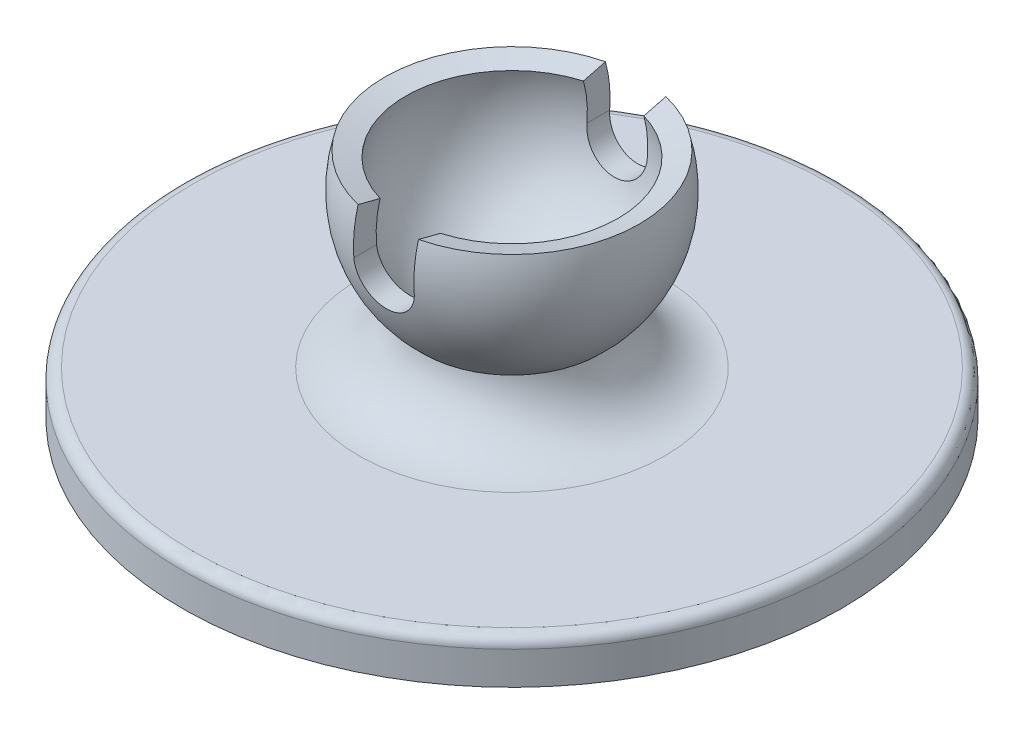
ISO-10303-21;
HEADER;
FILE_DESCRIPTION(('STEP AP214'),'2;1');
FILE_NAME('part.step','',(''),(''),'','','');
FILE_SCHEMA(('AUTOMOTIVE_DESIGN { 1 0 10303 214 1 1 1 1 }'));
ENDSEC;
DATA;
#1=APPLICATION_CONTEXT('core data for automotive mechanical design processes');
#2=APPLICATION_PROTOCOL_DEFINITION('international standard','automotive_design',2000,#1);
#3=PRODUCT_CONTEXT('',#1,'mechanical');
#4=PRODUCT('Part','Part','',(#3));
#5=PRODUCT_RELATED_PRODUCT_CATEGORY('part','',(#4));
#6=PRODUCT_DEFINITION_FORMATION('','',#4);
#7=PRODUCT_DEFINITION_CONTEXT('part definition',#1,'design');
#8=PRODUCT_DEFINITION('design','',#6,#7);
#9=PRODUCT_DEFINITION_SHAPE('','',#8);
#10=(LENGTH_UNIT() NAMED_UNIT(*) SI_UNIT(.MILLI.,.METRE.));
#11=(NAMED_UNIT(*) PLANE_ANGLE_UNIT() SI_UNIT($,.RADIAN.));
#12=(NAMED_UNIT(*) SI_UNIT($,.STERADIAN.) SOLID_ANGLE_UNIT());
#13=UNCERTAINTY_MEASURE_WITH_UNIT(LENGTH_MEASURE(1.E-05),#10,'distance_accuracy_value','');
#14=(GEOMETRIC_REPRESENTATION_CONTEXT(3) GLOBAL_UNCERTAINTY_ASSIGNED_CONTEXT((#13)) GLOBAL_UNIT_ASSIGNED_CONTEXT((#10,
#11,#12)) REPRESENTATION_CONTEXT('',''));
#15=CARTESIAN_POINT('',(0.,0.,0.));
#16=DIRECTION('',(0.,0.,1.));
#17=DIRECTION('',(1.,0.,0.));
#18=AXIS2_PLACEMENT_3D('',#15,#16,#17);
#19=CARTESIAN_POINT('',(0.,8.55291427061511,0.));
#20=DIRECTION('',(0.,1.,0.));
#21=DIRECTION('',(-1.,0.,0.));
#22=AXIS2_PLACEMENT_3D('',#19,#20,#21);
#23=CONICAL_SURFACE('',#22,5.79555495773441,1.30899693899575);
#24=CARTESIAN_POINT('',(0.,8.55291427061511,0.));
#25=DIRECTION('',(0.,1.,0.));
#26=DIRECTION('',(-1.,0.,0.));
#27=AXIS2_PLACEMENT_3D('',#24,#25,#26);
#28=CIRCLE('',#27,5.79555495773441);
#29=CARTESIAN_POINT('',(-1.375,8.55291427061511,-5.63008279407327));
#30=VERTEX_POINT('',#29);
#31=CARTESIAN_POINT('',(-1.375,8.55291427061511,5.63008279407327));
#32=VERTEX_POINT('',#31);
#33=EDGE_CURVE('E132',#30,#32,#28,.T.);
#34=ORIENTED_EDGE('',*,*,#33,.T.);
#35=CARTESIAN_POINT('',(-1.375,10.4367350616613,12.7521544498145));
#36=CARTESIAN_POINT('',(-1.375,10.2939405256424,12.2161041387018));
#37=CARTESIAN_POINT('',(-1.375,10.1512212962795,11.6800337180274));
#38=CARTESIAN_POINT('',(-1.375,9.86580186331822,10.606780273529));
#39=CARTESIAN_POINT('',(-1.375,9.72310222774603,10.0695970986722));
#40=CARTESIAN_POINT('',(-1.375,9.43218092227778,8.9726348821279));
#41=CARTESIAN_POINT('',(-1.375,9.28397803003374,8.41285085504461));
#42=CARTESIAN_POINT('',(-1.375,9.06246145117722,7.57355282622851));
#43=CARTESIAN_POINT('',(-1.375,8.98882575742838,7.2941238333845));
#44=CARTESIAN_POINT('',(-1.375,8.84185753215335,6.73519643013197));
#45=CARTESIAN_POINT('',(-1.375,8.76852499021496,6.45569802246306));
#46=CARTESIAN_POINT('',(-1.375,8.62676192318278,5.91367818110676));
#47=CARTESIAN_POINT('',(-1.375,8.55830578503265,5.65116344925173));
#48=CARTESIAN_POINT('',(-1.375,8.42194435428133,5.12595497051009));
#49=CARTESIAN_POINT('',(-1.375,8.35403913301479,4.86326120506873));
#50=CARTESIAN_POINT('',(-1.375,8.21869272015601,4.33606321081525));
#51=CARTESIAN_POINT('',(-1.375,8.15125680515652,4.07155762664674));
#52=CARTESIAN_POINT('',(-1.375,8.01786415899113,3.54230410428294));
#53=CARTESIAN_POINT('',(-1.375,7.95190674295933,3.27755634000286));
#54=CARTESIAN_POINT('',(-1.375,7.85591170884192,2.88370413083946));
#55=CARTESIAN_POINT('',(-1.375,7.82484334352691,2.75485147964918));
#56=CARTESIAN_POINT('',(-1.375,7.76361653212868,2.49693001993708));
#57=CARTESIAN_POINT('',(-1.375,7.73345808184057,2.36786121241707));
#58=CARTESIAN_POINT('',(-1.375,7.67439175519903,2.10916594741611));
#59=CARTESIAN_POINT('',(-1.375,7.64548648473158,1.97953889140758));
#60=CARTESIAN_POINT('',(-1.375,7.58964236993162,1.7198633501757));
#61=CARTESIAN_POINT('',(-1.375,7.56270344515201,1.58981488242074));
#62=CARTESIAN_POINT('',(-1.375,7.51218219548286,1.33077691992004));
#63=CARTESIAN_POINT('',(-1.375,7.48856146207588,1.20179505677248));
#64=CARTESIAN_POINT('',(-1.375,7.44591832613553,0.943044784825864));
#65=CARTESIAN_POINT('',(-1.375,7.42689619246422,0.813276330492376));
#66=CARTESIAN_POINT('',(-1.375,7.39594424063566,0.55340568454436));
#67=CARTESIAN_POINT('',(-1.375,7.3839840236685,0.423307380654786));
#68=CARTESIAN_POINT('',(-1.375,7.37305852636488,0.227800356470101));
#69=CARTESIAN_POINT('',(-1.375,7.37058563557824,0.16258386615113));
#70=CARTESIAN_POINT('',(-1.375,7.36811888586144,0.0321025616662649));
#71=CARTESIAN_POINT('',(-1.375,7.36812499520035,-0.0331622518704042));
#72=CARTESIAN_POINT('',(-1.375,7.37060127685139,-0.162672353823233));
#73=CARTESIAN_POINT('',(-1.375,7.37303478429299,-0.22691836285488));
#74=CARTESIAN_POINT('',(-1.375,7.38015812224114,-0.355287346135869));
#75=CARTESIAN_POINT('',(-1.375,7.38484813781129,-0.419410309860729));
#76=CARTESIAN_POINT('',(-1.375,7.40192684781888,-0.611568958392389));
#77=CARTESIAN_POINT('',(-1.375,7.41732270942996,-0.739337245584281));
#78=CARTESIAN_POINT('',(-1.375,7.45378224315079,-0.994604379941283));
#79=CARTESIAN_POINT('',(-1.375,7.47487119994015,-1.12209940384625));
#80=CARTESIAN_POINT('',(-1.375,7.52069515879427,-1.37639448649705));
#81=CARTESIAN_POINT('',(-1.375,7.54542944333312,-1.50319467692719));
#82=CARTESIAN_POINT('',(-1.375,7.59761230337411,-1.75798873494448));
#83=CARTESIAN_POINT('',(-1.375,7.62509265023422,-1.88597599935786));
#84=CARTESIAN_POINT('',(-1.375,7.68166022775117,-2.14159681702443));
#85=CARTESIAN_POINT('',(-1.375,7.71074751182396,-2.26923035837129));
#86=CARTESIAN_POINT('',(-1.375,7.76995699612921,-2.52398238491578));
#87=CARTESIAN_POINT('',(-1.375,7.80007697151843,-2.65110138969959));
#88=CARTESIAN_POINT('',(-1.375,7.86108870284829,-2.90515440309123));
#89=CARTESIAN_POINT('',(-1.375,7.89198046392286,-3.03208841046252));
#90=CARTESIAN_POINT('',(-1.375,7.98729880417245,-3.42009076142074));
#91=CARTESIAN_POINT('',(-1.375,8.05261481154021,-3.68094021118909));
#92=CARTESIAN_POINT('',(-1.375,8.18453159742587,-4.20231460957527));
#93=CARTESIAN_POINT('',(-1.375,8.25113238817949,-4.46283955507749));
#94=CARTESIAN_POINT('',(-1.375,8.38475659536228,-4.98223391526075));
#95=CARTESIAN_POINT('',(-1.375,8.45177559096703,-5.24110446793509));
#96=CARTESIAN_POINT('',(-1.375,8.58632936357547,-5.75871161943135));
#97=CARTESIAN_POINT('',(-1.375,8.65386414120847,-6.01744821808942));
#98=CARTESIAN_POINT('',(-1.375,8.86556783992799,-6.82630364651311));
#99=CARTESIAN_POINT('',(-1.375,9.01034663893564,-7.37626276391492));
#100=CARTESIAN_POINT('',(-1.375,9.30096296331856,-8.47701611075896));
#101=CARTESIAN_POINT('',(-1.375,9.44680197550137,-9.02780994677909));
#102=CARTESIAN_POINT('',(-1.375,9.73331396681568,-10.1080556987962));
#103=CARTESIAN_POINT('',(-1.375,9.87396949005197,-10.6375122449983));
#104=CARTESIAN_POINT('',(-1.375,10.1553049713321,-11.6953702764765));
#105=CARTESIAN_POINT('',(-1.375,10.295984402895,-12.2237719017442));
#106=CARTESIAN_POINT('',(-1.375,10.4367350616613,-12.7521544498145));
#107=B_SPLINE_CURVE_WITH_KNOTS('',3,(#35,#36,#37,#38,#39,#40,#41,#42,#43,#44,#45,#46,#47,#48,
#49,#50,#51,#52,#53,#54,#55,#56,#57,#58,#59,#60,#61,#62,#63,#64,#65,#66,#67,#68,#69,#70,#71,#72,
#73,#74,#75,#76,#77,#78,#79,#80,#81,#82,#83,#84,#85,#86,#87,#88,#89,#90,#91,#92,#93,#94,#95,#96,
#97,#98,#99,#100,#101,#102,#103,#104,#105,#106),.UNSPECIFIED.,.F.,.F.,(4,2,2,2,2,2,2,2,2,2,2,2,
2,2,2,2,2,2,2,2,2,2,2,2,2,2,2,2,2,2,2,2,2,2,2,4),(0.,1.66423018797367,3.33167143955776,
5.06888145688579,5.93578676421642,6.80266204478165,7.61654256206226,8.43052683336998,
9.2494253906599,10.06793643575,10.4655700272778,10.8632017809835,11.261624187481,
11.6600302845793,12.0533580279374,12.446708762065,12.8383536910249,13.0341016625097,
13.2298471284419,13.4226800399929,13.6155287690973,14.0013974067198,14.3890088249422,
14.7765440495507,15.1692422650252,15.5619535419857,15.9538662195373,16.3457815047919,
17.1524820433442,17.9591902683671,18.7614047707779,19.5636202521433,21.2697088299228,
22.9790318687417,24.6224957455097,26.262919566886),.UNSPECIFIED.);
#108=CARTESIAN_POINT('',(-1.375,8.29409522551259,4.62976160804263));
#109=VERTEX_POINT('',#108);
#110=EDGE_CURVE('E262',#32,#109,#107,.T.);
#111=ORIENTED_EDGE('',*,*,#110,.T.);
#112=CARTESIAN_POINT('',(0.,8.29409522551259,0.));
#113=DIRECTION('',(0.,1.,0.));
#114=DIRECTION('',(-1.,0.,0.));
#115=AXIS2_PLACEMENT_3D('',#112,#113,#114);
#116=CIRCLE('',#115,4.82962913144534);
#117=CARTESIAN_POINT('',(-1.375,8.29409522551259,-4.62976160804263));
#118=VERTEX_POINT('',#117);
#119=EDGE_CURVE('E131',#118,#109,#116,.T.);
#120=ORIENTED_EDGE('',*,*,#119,.F.);
#121=EDGE_CURVE('E255',#118,#30,#107,.T.);
#122=ORIENTED_EDGE('',*,*,#121,.T.);
#123=EDGE_LOOP('',(#34,#111,#120,#122));
#124=FACE_BOUND('',#123,.T.);
#125=ADVANCED_FACE('F39',(#124),#23,.F.);
#126=CARTESIAN_POINT('',(0.,7.,0.));
#127=DIRECTION('',(0.,1.,0.));
#128=DIRECTION('',(1.,0.,0.));
#129=AXIS2_PLACEMENT_3D('',#126,#127,#128);
#130=SPHERICAL_SURFACE('',#129,5.);
#131=CARTESIAN_POINT('',(1.37499998545454,6.55311427061511,-4.78640451538231));
#132=CARTESIAN_POINT('',(1.37500528297491,6.51430126790258,-4.78277911577127));
#133=CARTESIAN_POINT('',(1.37336685293072,6.47550698321892,-4.77915129399472));
#134=CARTESIAN_POINT('',(1.36681881040177,6.39819544931805,-4.77191337559944));
#135=CARTESIAN_POINT('',(1.36190932943121,6.35967818902587,-4.76830327827395));
#136=CARTESIAN_POINT('',(1.34231782244719,6.24500960658604,-4.7575435872938));
#137=CARTESIAN_POINT('',(1.32277263810338,6.16962546774132,-4.75045375687791));
#138=CARTESIAN_POINT('',(1.27124395859788,6.02319819626549,-4.73665284084782));
#139=CARTESIAN_POINT('',(1.23925423279572,5.9521572588057,-4.72994194688713));
#140=CARTESIAN_POINT('',(1.16373209520521,5.81645151384963,-4.71709726653807));
#141=CARTESIAN_POINT('',(1.12020231839781,5.75178525541841,-4.71096334883929));
#142=CARTESIAN_POINT('',(1.0229073970323,5.63079612908687,-4.69946706396581));
#143=CARTESIAN_POINT('',(0.969161172519895,5.57445817538348,-4.69410330225754));
#144=CARTESIAN_POINT('',(0.852886189336373,5.47160256071342,-4.68429668054793));
#145=CARTESIAN_POINT('',(0.790356243825605,5.42508622895515,-4.67985394519509));
#146=CARTESIAN_POINT('',(0.658579219369513,5.34341774554799,-4.67204530400247));
#147=CARTESIAN_POINT('',(0.589361830018682,5.30821811767688,-4.66867490011672));
#148=CARTESIAN_POINT('',(0.445960258163163,5.24994322122235,-4.66309100009007));
#149=CARTESIAN_POINT('',(0.371776516541546,5.22686687801105,-4.66087740140814));
#150=CARTESIAN_POINT('',(0.220867335139111,5.19358024489035,-4.6576833545116));
#151=CARTESIAN_POINT('',(0.144153420912766,5.18331816595454,-4.65669794259356));
#152=CARTESIAN_POINT('',(-0.00991658740455385,5.17578860696215,-4.65597498147918));
#153=CARTESIAN_POINT('',(-0.0872726862421035,5.17852122303871,-4.65623744151444));
#154=CARTESIAN_POINT('',(-0.24026320727085,5.19688239475166,-4.65800011873146));
#155=CARTESIAN_POINT('',(-0.315900821206814,5.21248461799225,-4.65949780851917));
#156=CARTESIAN_POINT('',(-0.463474624545935,5.25609651077214,-4.66368054856329));
#157=CARTESIAN_POINT('',(-0.535410820820773,5.28410615727613,-4.66636559661529));
#158=CARTESIAN_POINT('',(-0.673623474159115,5.35175556642704,-4.67284259988296));
#159=CARTESIAN_POINT('',(-0.739894198369826,5.39140693352851,-4.67663565954421));
#160=CARTESIAN_POINT('',(-0.864834948393785,5.48118530906919,-4.68521058454212));
#161=CARTESIAN_POINT('',(-0.923505226019871,5.5313119703042,-4.68999241710579));
#162=CARTESIAN_POINT('',(-1.0318003454004,5.6407947210351,-4.70041756475713));
#163=CARTESIAN_POINT('',(-1.08139403828343,5.70018134389337,-4.70606372868493));
#164=CARTESIAN_POINT('',(-1.16993053509676,5.82639494863142,-4.71803903118186));
#165=CARTESIAN_POINT('',(-1.20886971573784,5.8932244507737,-4.72436840107156));
#166=CARTESIAN_POINT('',(-1.27516835147245,6.03275025512386,-4.73755392757096));
#167=CARTESIAN_POINT('',(-1.30246899860547,6.10547419273148,-4.74441255739575));
#168=CARTESIAN_POINT('',(-1.34442333882716,6.25439121430189,-4.75842488807807));
#169=CARTESIAN_POINT('',(-1.35909594238095,6.33057893048771,-4.76557813086043));
#170=CARTESIAN_POINT('',(-1.36985407332995,6.43157999844662,-4.77503936446521));
#171=CARTESIAN_POINT('',(-1.37178792293725,6.45586823479987,-4.77731292240297));
#172=CARTESIAN_POINT('',(-1.37436088804589,6.50447245272316,-4.78185938670168));
#173=CARTESIAN_POINT('',(-1.37500215014147,6.5287883210832,-4.78413228786497));
#174=CARTESIAN_POINT('',(-1.37499998545455,6.55311427061511,-4.78640451538231));
#175=B_SPLINE_CURVE_WITH_KNOTS('',3,(#131,#132,#133,#134,#135,#136,#137,#138,#139,#140,#141,
#142,#143,#144,#145,#146,#147,#148,#149,#150,#151,#152,#153,#154,#155,#156,#157,#158,#159,#160,
#161,#162,#163,#164,#165,#166,#167,#168,#169,#170,#171,#172,#173,#174),.UNSPECIFIED.,.F.,.F.,(4,
2,2,2,2,2,2,2,2,2,2,2,2,2,2,2,2,2,2,2,2,4),(0.,0.11687414251704,0.233743586336421,
0.467137354158578,0.700648126542882,0.934105626434992,1.16713492110962,1.40019573259942,
1.63226563919946,1.86431497126929,2.09542340506417,2.32653354857328,2.55717198911825,
2.78781000146747,3.01867869861877,3.2495397448278,3.48117877906975,3.7128964893698,
3.94577154634227,4.17829726366096,4.25168612359987,4.3249530062451),.UNSPECIFIED.);
#176=CARTESIAN_POINT('',(1.375,6.55291427061511,-4.78638583386049));
#177=VERTEX_POINT('',#176);
#178=CARTESIAN_POINT('',(-1.375,6.55291427061511,-4.78638583386049));
#179=VERTEX_POINT('',#178);
#180=EDGE_CURVE('E179',#177,#179,#175,.T.);
#181=ORIENTED_EDGE('',*,*,#180,.T.);
#182=CARTESIAN_POINT('',(-1.375,7.,0.));
#183=DIRECTION('',(-1.,0.,0.));
#184=DIRECTION('',(0.,-1.,0.));
#185=AXIS2_PLACEMENT_3D('',#182,#183,#184);
#186=CIRCLE('',#185,4.80722113075735);
#187=EDGE_CURVE('E190',#179,#118,#186,.F.);
#188=ORIENTED_EDGE('',*,*,#187,.T.);
#189=ORIENTED_EDGE('',*,*,#119,.T.);
#190=CARTESIAN_POINT('',(-1.375,6.55291427061511,4.78638583386049));
#191=VERTEX_POINT('',#190);
#192=EDGE_CURVE('E189',#109,#191,#186,.F.);
#193=ORIENTED_EDGE('',*,*,#192,.T.);
#194=CARTESIAN_POINT('',(-1.37499998545455,6.55311427061511,4.78640451538231));
#195=CARTESIAN_POINT('',(-1.37500528297491,6.51430126790258,4.78277911577127));
#196=CARTESIAN_POINT('',(-1.37336685293072,6.47550698321892,4.77915129399472));
#197=CARTESIAN_POINT('',(-1.36681881040177,6.39819544931805,4.77191337559944));
#198=CARTESIAN_POINT('',(-1.36190932943121,6.35967818902587,4.76830327827395));
#199=CARTESIAN_POINT('',(-1.34231782244719,6.24500960658604,4.7575435872938));
#200=CARTESIAN_POINT('',(-1.32277263810338,6.16962546774132,4.75045375687791));
#201=CARTESIAN_POINT('',(-1.27124395859788,6.02319819626549,4.73665284084782));
#202=CARTESIAN_POINT('',(-1.23925423279572,5.9521572588057,4.72994194688713));
#203=CARTESIAN_POINT('',(-1.16373209520522,5.81645151384963,4.71709726653807));
#204=CARTESIAN_POINT('',(-1.12020231839781,5.75178525541841,4.71096334883928));
#205=CARTESIAN_POINT('',(-1.0229073970323,5.63079612908688,4.69946706396581));
#206=CARTESIAN_POINT('',(-0.969161172519896,5.57445817538348,4.69410330225754));
#207=CARTESIAN_POINT('',(-0.852886189336375,5.47160256071342,4.68429668054793));
#208=CARTESIAN_POINT('',(-0.790356243825606,5.42508622895515,4.67985394519509));
#209=CARTESIAN_POINT('',(-0.658579219369515,5.34341774554799,4.67204530400247));
#210=CARTESIAN_POINT('',(-0.589361830018684,5.30821811767688,4.66867490011672));
#211=CARTESIAN_POINT('',(-0.445960258163165,5.24994322122235,4.66309100009007));
#212=CARTESIAN_POINT('',(-0.371776516541548,5.22686687801105,4.66087740140814));
#213=CARTESIAN_POINT('',(-0.220867335139113,5.19358024489035,4.6576833545116));
#214=CARTESIAN_POINT('',(-0.144153420912768,5.18331816595454,4.65669794259356));
#215=CARTESIAN_POINT('',(0.00991658740455182,5.17578860696215,4.65597498147918));
#216=CARTESIAN_POINT('',(0.0872726862421014,5.17852122303871,4.65623744151444));
#217=CARTESIAN_POINT('',(0.240263207270848,5.19688239475166,4.65800011873146));
#218=CARTESIAN_POINT('',(0.315900821206812,5.21248461799225,4.65949780851917));
#219=CARTESIAN_POINT('',(0.463474624545933,5.25609651077214,4.66368054856329));
#220=CARTESIAN_POINT('',(0.535410820820771,5.28410615727613,4.66636559661529));
#221=CARTESIAN_POINT('',(0.673623474159114,5.35175556642704,4.67284259988296));
#222=CARTESIAN_POINT('',(0.739894198369824,5.39140693352851,4.67663565954421));
#223=CARTESIAN_POINT('',(0.864834948393783,5.48118530906919,4.68521058454212));
#224=CARTESIAN_POINT('',(0.923505226019869,5.5313119703042,4.68999241710579));
#225=CARTESIAN_POINT('',(1.0318003454004,5.6407947210351,4.70041756475713));
#226=CARTESIAN_POINT('',(1.08139403828343,5.70018134389337,4.70606372868493));
#227=CARTESIAN_POINT('',(1.16993053509676,5.82639494863142,4.71803903118186));
#228=CARTESIAN_POINT('',(1.20886971573784,5.8932244507737,4.72436840107156));
#229=CARTESIAN_POINT('',(1.27516835147245,6.03275025512386,4.73755392757096));
#230=CARTESIAN_POINT('',(1.30246899860547,6.10547419273148,4.74441255739575));
#231=CARTESIAN_POINT('',(1.34442333882716,6.25439121430189,4.75842488807807));
#232=CARTESIAN_POINT('',(1.35909594238095,6.3305789304877,4.76557813086043));
#233=CARTESIAN_POINT('',(1.36985407332995,6.43157999844662,4.77503936446521));
#234=CARTESIAN_POINT('',(1.37178792293724,6.45586823479987,4.77731292240297));
#235=CARTESIAN_POINT('',(1.37436088804589,6.50447245272316,4.78185938670168));
#236=CARTESIAN_POINT('',(1.37500215014147,6.5287883210832,4.78413228786497));
#237=CARTESIAN_POINT('',(1.37499998545454,6.55311427061511,4.78640451538231));
#238=B_SPLINE_CURVE_WITH_KNOTS('',3,(#194,#195,#196,#197,#198,#199,#200,#201,#202,#203,#204,
#205,#206,#207,#208,#209,#210,#211,#212,#213,#214,#215,#216,#217,#218,#219,#220,#221,#222,#223,
#224,#225,#226,#227,#228,#229,#230,#231,#232,#233,#234,#235,#236,#237),.UNSPECIFIED.,.F.,.F.,(4,
2,2,2,2,2,2,2,2,2,2,2,2,2,2,2,2,2,2,2,2,4),(0.,0.11687414251704,0.233743586336421,
0.467137354158578,0.700648126542882,0.934105626434992,1.16713492110962,1.40019573259942,
1.63226563919946,1.86431497126929,2.09542340506417,2.32653354857327,2.55717198911825,
2.78781000146747,3.01867869861877,3.2495397448278,3.48117877906975,3.7128964893698,
3.94577154634227,4.17829726366096,4.25168612359987,4.3249530062451),.UNSPECIFIED.);
#239=CARTESIAN_POINT('',(1.375,6.55291427061511,4.78638583386049));
#240=VERTEX_POINT('',#239);
#241=EDGE_CURVE('E188',#191,#240,#238,.T.);
#242=ORIENTED_EDGE('',*,*,#241,.T.);
#243=CARTESIAN_POINT('',(1.375,7.,0.));
#244=DIRECTION('',(1.,0.,0.));
#245=DIRECTION('',(0.,1.,0.));
#246=AXIS2_PLACEMENT_3D('',#243,#244,#245);
#247=CIRCLE('',#246,4.80722113075735);
#248=CARTESIAN_POINT('',(1.375,8.29409522551259,4.62976160804263));
#249=VERTEX_POINT('',#248);
#250=EDGE_CURVE('E124',#240,#249,#247,.F.);
#251=ORIENTED_EDGE('',*,*,#250,.T.);
#252=CARTESIAN_POINT('',(1.375,8.29409522551259,-4.62976160804263));
#253=VERTEX_POINT('',#252);
#254=EDGE_CURVE('E122',#249,#253,#116,.T.);
#255=ORIENTED_EDGE('',*,*,#254,.T.);
#256=EDGE_CURVE('E125',#253,#177,#247,.F.);
#257=ORIENTED_EDGE('',*,*,#256,.T.);
#258=EDGE_LOOP('',(#181,#188,#189,#193,#242,#251,#255,#257));
#259=FACE_BOUND('',#258,.T.);
#260=ADVANCED_FACE('F196',(#259),#130,.F.);
#261=CARTESIAN_POINT('',(1.375,8.55291427061511,5.63008279407327));
#262=VERTEX_POINT('',#261);
#263=CARTESIAN_POINT('',(1.375,8.55291427061511,-5.63008279407327));
#264=VERTEX_POINT('',#263);
#265=EDGE_CURVE('E120',#262,#264,#28,.T.);
#266=ORIENTED_EDGE('',*,*,#265,.T.);
#267=CARTESIAN_POINT('',(1.375,10.4367350616613,-12.7521544498145));
#268=CARTESIAN_POINT('',(1.375,10.2939405256424,-12.2161041387018));
#269=CARTESIAN_POINT('',(1.375,10.1512212962795,-11.6800337180274));
#270=CARTESIAN_POINT('',(1.375,9.86580186331822,-10.606780273529));
#271=CARTESIAN_POINT('',(1.375,9.72310222774603,-10.0695970986722));
#272=CARTESIAN_POINT('',(1.375,9.43218092227778,-8.9726348821279));
#273=CARTESIAN_POINT('',(1.375,9.28397803003374,-8.41285085504461));
#274=CARTESIAN_POINT('',(1.375,9.06246145117722,-7.57355282622851));
#275=CARTESIAN_POINT('',(1.375,8.98882575742838,-7.29412383338451));
#276=CARTESIAN_POINT('',(1.375,8.84185753215335,-6.73519643013197));
#277=CARTESIAN_POINT('',(1.375,8.76852499021496,-6.45569802246306));
#278=CARTESIAN_POINT('',(1.375,8.62676192318278,-5.91367818110676));
#279=CARTESIAN_POINT('',(1.375,8.55830578503265,-5.65116344925173));
#280=CARTESIAN_POINT('',(1.375,8.42194435428132,-5.12595497051009));
#281=CARTESIAN_POINT('',(1.375,8.35403913301478,-4.86326120506873));
#282=CARTESIAN_POINT('',(1.375,8.21869272015601,-4.33606321081525));
#283=CARTESIAN_POINT('',(1.375,8.15125680515652,-4.07155762664674));
#284=CARTESIAN_POINT('',(1.375,8.01786415899113,-3.54230410428294));
#285=CARTESIAN_POINT('',(1.375,7.95190674295933,-3.27755634000286));
#286=CARTESIAN_POINT('',(1.375,7.85591170884192,-2.88370413083946));
#287=CARTESIAN_POINT('',(1.375,7.82484334352691,-2.75485147964918));
#288=CARTESIAN_POINT('',(1.375,7.76361653212868,-2.49693001993708));
#289=CARTESIAN_POINT('',(1.375,7.73345808184057,-2.36786121241707));
#290=CARTESIAN_POINT('',(1.375,7.67439175519903,-2.10916594741611));
#291=CARTESIAN_POINT('',(1.375,7.64548648473158,-1.97953889140758));
#292=CARTESIAN_POINT('',(1.375,7.58964236993162,-1.7198633501757));
#293=CARTESIAN_POINT('',(1.375,7.56270344515201,-1.58981488242074));
#294=CARTESIAN_POINT('',(1.375,7.51218219548286,-1.33077691992004));
#295=CARTESIAN_POINT('',(1.375,7.48856146207588,-1.20179505677248));
#296=CARTESIAN_POINT('',(1.375,7.44591832613553,-0.943044784825863));
#297=CARTESIAN_POINT('',(1.375,7.42689619246421,-0.813276330492374));
#298=CARTESIAN_POINT('',(1.375,7.39594424063566,-0.55340568454436));
#299=CARTESIAN_POINT('',(1.375,7.3839840236685,-0.423307380654786));
#300=CARTESIAN_POINT('',(1.375,7.37305852636488,-0.227800356470101));
#301=CARTESIAN_POINT('',(1.375,7.37058563557824,-0.16258386615113));
#302=CARTESIAN_POINT('',(1.375,7.36811888586144,-0.032102561666265));
#303=CARTESIAN_POINT('',(1.375,7.36812499520035,0.0331622518704041));
#304=CARTESIAN_POINT('',(1.375,7.37060127685139,0.162672353823233));
#305=CARTESIAN_POINT('',(1.375,7.37303478429299,0.226918362854879));
#306=CARTESIAN_POINT('',(1.375,7.38015812224114,0.355287346135868));
#307=CARTESIAN_POINT('',(1.375,7.38484813781129,0.419410309860729));
#308=CARTESIAN_POINT('',(1.375,7.40192684781888,0.611568958392389));
#309=CARTESIAN_POINT('',(1.375,7.41732270942996,0.739337245584281));
#310=CARTESIAN_POINT('',(1.375,7.45378224315079,0.994604379941283));
#311=CARTESIAN_POINT('',(1.375,7.47487119994015,1.12209940384625));
#312=CARTESIAN_POINT('',(1.375,7.52069515879427,1.37639448649705));
#313=CARTESIAN_POINT('',(1.375,7.54542944333312,1.50319467692719));
#314=CARTESIAN_POINT('',(1.375,7.59761230337411,1.75798873494447));
#315=CARTESIAN_POINT('',(1.375,7.62509265023422,1.88597599935786));
#316=CARTESIAN_POINT('',(1.375,7.68166022775117,2.14159681702443));
#317=CARTESIAN_POINT('',(1.375,7.71074751182396,2.26923035837129));
#318=CARTESIAN_POINT('',(1.375,7.76995699612921,2.52398238491578));
#319=CARTESIAN_POINT('',(1.375,7.80007697151843,2.65110138969959));
#320=CARTESIAN_POINT('',(1.375,7.86108870284829,2.90515440309124));
#321=CARTESIAN_POINT('',(1.375,7.89198046392286,3.03208841046252));
#322=CARTESIAN_POINT('',(1.375,7.98729880417245,3.42009076142074));
#323=CARTESIAN_POINT('',(1.375,8.05261481154021,3.68094021118909));
#324=CARTESIAN_POINT('',(1.375,8.18453159742587,4.20231460957528));
#325=CARTESIAN_POINT('',(1.375,8.2511323881795,4.46283955507749));
#326=CARTESIAN_POINT('',(1.375,8.38475659536229,4.98223391526075));
#327=CARTESIAN_POINT('',(1.375,8.45177559096703,5.2411044679351));
#328=CARTESIAN_POINT('',(1.375,8.58632936357547,5.75871161943136));
#329=CARTESIAN_POINT('',(1.375,8.65386414120847,6.01744821808942));
#330=CARTESIAN_POINT('',(1.375,8.86556783992799,6.82630364651311));
#331=CARTESIAN_POINT('',(1.375,9.01034663893564,7.37626276391492));
#332=CARTESIAN_POINT('',(1.375,9.30096296331856,8.47701611075896));
#333=CARTESIAN_POINT('',(1.375,9.44680197550137,9.02780994677909));
#334=CARTESIAN_POINT('',(1.375,9.73331396681568,10.1080556987962));
#335=CARTESIAN_POINT('',(1.375,9.87396949005197,10.6375122449983));
#336=CARTESIAN_POINT('',(1.375,10.1553049713321,11.6953702764765));
#337=CARTESIAN_POINT('',(1.375,10.295984402895,12.2237719017442));
#338=CARTESIAN_POINT('',(1.375,10.4367350616613,12.7521544498145));
#339=B_SPLINE_CURVE_WITH_KNOTS('',3,(#267,#268,#269,#270,#271,#272,#273,#274,#275,#276,#277,
#278,#279,#280,#281,#282,#283,#284,#285,#286,#287,#288,#289,#290,#291,#292,#293,#294,#295,#296,
#297,#298,#299,#300,#301,#302,#303,#304,#305,#306,#307,#308,#309,#310,#311,#312,#313,#314,#315,
#316,#317,#318,#319,#320,#321,#322,#323,#324,#325,#326,#327,#328,#329,#330,#331,#332,#333,#334,
#335,#336,#337,#338),.UNSPECIFIED.,.F.,.F.,(4,2,2,2,2,2,2,2,2,2,2,2,2,2,2,2,2,2,2,2,2,2,2,2,2,2,
2,2,2,2,2,2,2,2,2,4),(0.,1.66423018797367,3.33167143955776,5.06888145688578,5.93578676421642,
6.80266204478165,7.61654256206226,8.43052683336998,9.2494253906599,10.06793643575,
10.4655700272778,10.8632017809835,11.261624187481,11.6600302845793,12.0533580279374,
12.446708762065,12.8383536910249,13.0341016625097,13.2298471284419,13.4226800399929,
13.6155287690973,14.0013974067198,14.3890088249422,14.7765440495507,15.1692422650252,
15.5619535419857,15.9538662195373,16.345781504792,17.1524820433442,17.9591902683671,
18.7614047707779,19.5636202521433,21.2697088299228,22.9790318687417,24.6224957455097,
26.262919566886),.UNSPECIFIED.);
#340=EDGE_CURVE('E63',#264,#253,#339,.T.);
#341=ORIENTED_EDGE('',*,*,#340,.T.);
#342=ORIENTED_EDGE('',*,*,#254,.F.);
#343=EDGE_CURVE('E106',#249,#262,#339,.T.);
#344=ORIENTED_EDGE('',*,*,#343,.T.);
#345=EDGE_LOOP('',(#266,#341,#342,#344));
#346=FACE_BOUND('',#345,.T.);
#347=ADVANCED_FACE('F119',(#346),#23,.F.);
#348=CARTESIAN_POINT('',(0.,7.,0.));
#349=DIRECTION('',(0.,1.,0.));
#350=DIRECTION('',(1.,0.,0.));
#351=AXIS2_PLACEMENT_3D('',#348,#349,#350);
#352=SPHERICAL_SURFACE('',#351,6.);
#353=CARTESIAN_POINT('',(1.37499998545454,6.55311427061511,5.82320085390089));
#354=CARTESIAN_POINT('',(1.37500530624174,6.51434435202441,5.82022424310282));
#355=CARTESIAN_POINT('',(1.37337048600321,6.47559292596361,5.8172467412016));
#356=CARTESIAN_POINT('',(1.36683694726022,6.39836663814321,5.81130846408128));
#357=CARTESIAN_POINT('',(1.3619383673635,6.35989176470891,5.80834768815723));
#358=CARTESIAN_POINT('',(1.34239111131523,6.2453521392679,5.79952674626111));
#359=CARTESIAN_POINT('',(1.32289082118667,6.17005349806693,5.7937188379719));
#360=CARTESIAN_POINT('',(1.27148531851724,6.02379233757533,5.78242126095422));
#361=CARTESIAN_POINT('',(1.2395740278254,5.95283196263772,5.77693174967323));
#362=CARTESIAN_POINT('',(1.16424531464439,5.81727483711003,5.7664312302445));
#363=CARTESIAN_POINT('',(1.1208304059617,5.75267670044906,5.76142011788058));
#364=CARTESIAN_POINT('',(1.02377503838515,5.63176649919866,5.75202984806142));
#365=CARTESIAN_POINT('',(0.970147419467346,5.57544418565653,5.74764990907969));
#366=CARTESIAN_POINT('',(0.854136654124029,5.47259728719625,5.73964430992402));
#367=CARTESIAN_POINT('',(0.791752273467862,5.42607408573926,5.73601875625682));
#368=CARTESIAN_POINT('',(0.660196637048352,5.34430066458267,5.72964150192048));
#369=CARTESIAN_POINT('',(0.591045372369812,5.30901847632783,5.72688732328796));
#370=CARTESIAN_POINT('',(0.447776009475084,5.2505677086644,5.72232238436049));
#371=CARTESIAN_POINT('',(0.373658310762119,5.22739815622396,5.720511548285));
#372=CARTESIAN_POINT('',(0.222770014456501,5.19388697963472,5.71789188997539));
#373=CARTESIAN_POINT('',(0.146007078778142,5.18351106058976,5.71708038890914));
#374=CARTESIAN_POINT('',(-0.00817733181485162,5.17577365960829,5.71647527944882));
#375=CARTESIAN_POINT('',(-0.0855988150605987,5.17841234256128,5.71668168395118));
#376=CARTESIAN_POINT('',(-0.238790233451823,5.19661562816618,5.71810513272726));
#377=CARTESIAN_POINT('',(-0.314562266474153,5.21216269182227,5.71932080567813));
#378=CARTESIAN_POINT('',(-0.462414984185655,5.2557108930152,5.7227240005112));
#379=CARTESIAN_POINT('',(-0.53449567782667,5.28371200034823,5.72491152003645));
#380=CARTESIAN_POINT('',(-0.672975074800768,5.351384992482,5.73019398521992));
#381=CARTESIAN_POINT('',(-0.739369988597157,5.39106458395821,5.73328953008293));
#382=CARTESIAN_POINT('',(-0.864552441203925,5.48094819960726,5.74029442729023));
#383=CARTESIAN_POINT('',(-0.923340273128933,5.53115181807488,5.74420374826311));
#384=CARTESIAN_POINT('',(-1.03178503087212,5.64077262103442,5.75272948186391));
#385=CARTESIAN_POINT('',(-1.08142173696777,5.70020968601295,5.75734741994305));
#386=CARTESIAN_POINT('',(-1.1700327786287,5.8265518636475,5.76715014532446));
#387=CARTESIAN_POINT('',(-1.20900356779229,5.89345944985485,5.77233512036563));
#388=CARTESIAN_POINT('',(-1.2752942864854,6.03306239775837,5.78313772281799));
#389=CARTESIAN_POINT('',(-1.30257246554359,6.10577741776808,5.78875681744215));
#390=CARTESIAN_POINT('',(-1.34448681344909,6.25468059971853,5.80024569811683));
#391=CARTESIAN_POINT('',(-1.35914199872654,6.3308633545952,5.80611509304153));
#392=CARTESIAN_POINT('',(-1.36987383770857,6.43181270216514,5.8138805710558));
#393=CARTESIAN_POINT('',(-1.37180026412572,6.45605455864633,5.81574446307392));
#394=CARTESIAN_POINT('',(-1.37436334801416,6.50456577689204,5.81947256721213));
#395=CARTESIAN_POINT('',(-1.37500214139466,6.52883502618001,5.82133677366369));
#396=CARTESIAN_POINT('',(-1.3749999854546,6.5531142706151,5.82320085390095));
#397=B_SPLINE_CURVE_WITH_KNOTS('',3,(#353,#354,#355,#356,#357,#358,#359,#360,#361,#362,#363,
#364,#365,#366,#367,#368,#369,#370,#371,#372,#373,#374,#375,#376,#377,#378,#379,#380,#381,#382,
#383,#384,#385,#386,#387,#388,#389,#390,#391,#392,#393,#394,#395,#396),.UNSPECIFIED.,.F.,.F.,(4,
2,2,2,2,2,2,2,2,2,2,2,2,2,2,2,2,2,2,2,2,4),(0.,0.116580485224521,0.233156019739063,
0.465953933755806,0.69886600184556,0.931727215178989,1.16429757276692,1.39690074319601,
1.62883637835784,1.86075337881005,2.09204733628506,2.32334422416422,2.55432735548416,
2.78530992662194,3.01644526709779,3.24757169885703,3.47920284707785,3.71091091900637,
3.94343958840587,4.17561733961884,4.24876230177612,4.32178583182835),.UNSPECIFIED.);
#398=CARTESIAN_POINT('',(1.375,6.55291427061511,5.82318549855492));
#399=VERTEX_POINT('',#398);
#400=CARTESIAN_POINT('',(-1.375,6.55291427061511,5.82318549855492));
#401=VERTEX_POINT('',#400);
#402=EDGE_CURVE('E112',#399,#401,#397,.T.);
#403=ORIENTED_EDGE('',*,*,#402,.T.);
#404=CARTESIAN_POINT('',(-1.375,7.,0.));
#405=DIRECTION('',(-1.,0.,0.));
#406=DIRECTION('',(0.,-1.,0.));
#407=AXIS2_PLACEMENT_3D('',#404,#405,#406);
#408=CIRCLE('',#407,5.84032319311183);
#409=EDGE_CURVE('E245',#401,#32,#408,.T.);
#410=ORIENTED_EDGE('',*,*,#409,.T.);
#411=ORIENTED_EDGE('',*,*,#33,.F.);
#412=CARTESIAN_POINT('',(-1.375,6.55291427061511,-5.82318549855492));
#413=VERTEX_POINT('',#412);
#414=EDGE_CURVE('E113',#30,#413,#408,.T.);
#415=ORIENTED_EDGE('',*,*,#414,.T.);
#416=CARTESIAN_POINT('',(-1.37499998545455,6.55311427061511,-5.82320085390089));
#417=CARTESIAN_POINT('',(-1.37500530624174,6.51434435202441,-5.82022424310282));
#418=CARTESIAN_POINT('',(-1.37337048600321,6.47559292596361,-5.8172467412016));
#419=CARTESIAN_POINT('',(-1.36683694726022,6.39836663814321,-5.81130846408128));
#420=CARTESIAN_POINT('',(-1.36193836736351,6.35989176470891,-5.80834768815723));
#421=CARTESIAN_POINT('',(-1.34239111131523,6.2453521392679,-5.79952674626111));
#422=CARTESIAN_POINT('',(-1.32289082118667,6.17005349806693,-5.7937188379719));
#423=CARTESIAN_POINT('',(-1.27148531851724,6.02379233757533,-5.78242126095422));
#424=CARTESIAN_POINT('',(-1.2395740278254,5.95283196263772,-5.77693174967323));
#425=CARTESIAN_POINT('',(-1.16424531464439,5.81727483711003,-5.7664312302445));
#426=CARTESIAN_POINT('',(-1.1208304059617,5.75267670044906,-5.76142011788058));
#427=CARTESIAN_POINT('',(-1.02377503838515,5.63176649919866,-5.75202984806142));
#428=CARTESIAN_POINT('',(-0.970147419467347,5.57544418565654,-5.74764990907969));
#429=CARTESIAN_POINT('',(-0.854136654124031,5.47259728719625,-5.73964430992402));
#430=CARTESIAN_POINT('',(-0.791752273467864,5.42607408573926,-5.73601875625682));
#431=CARTESIAN_POINT('',(-0.660196637048354,5.34430066458267,-5.72964150192048));
#432=CARTESIAN_POINT('',(-0.591045372369813,5.30901847632783,-5.72688732328796));
#433=CARTESIAN_POINT('',(-0.447776009475086,5.2505677086644,-5.72232238436049));
#434=CARTESIAN_POINT('',(-0.373658310762121,5.22739815622396,-5.720511548285));
#435=CARTESIAN_POINT('',(-0.222770014456502,5.19388697963472,-5.71789188997539));
#436=CARTESIAN_POINT('',(-0.146007078778143,5.18351106058976,-5.71708038890914));
#437=CARTESIAN_POINT('',(0.00817733181484989,5.17577365960829,-5.71647527944882));
#438=CARTESIAN_POINT('',(0.0855988150605968,5.17841234256128,-5.71668168395118));
#439=CARTESIAN_POINT('',(0.238790233451821,5.19661562816618,-5.71810513272726));
#440=CARTESIAN_POINT('',(0.314562266474151,5.21216269182227,-5.71932080567813));
#441=CARTESIAN_POINT('',(0.462414984185654,5.2557108930152,-5.7227240005112));
#442=CARTESIAN_POINT('',(0.534495677826669,5.28371200034823,-5.72491152003645));
#443=CARTESIAN_POINT('',(0.672975074800766,5.351384992482,-5.73019398521992));
#444=CARTESIAN_POINT('',(0.739369988597156,5.39106458395821,-5.73328953008293));
#445=CARTESIAN_POINT('',(0.864552441203924,5.48094819960726,-5.74029442729023));
#446=CARTESIAN_POINT('',(0.923340273128932,5.53115181807488,-5.74420374826311));
#447=CARTESIAN_POINT('',(1.03178503087212,5.64077262103442,-5.75272948186391));
#448=CARTESIAN_POINT('',(1.08142173696776,5.70020968601295,-5.75734741994305));
#449=CARTESIAN_POINT('',(1.17003277862869,5.8265518636475,-5.76715014532446));
#450=CARTESIAN_POINT('',(1.20900356779229,5.89345944985485,-5.77233512036563));
#451=CARTESIAN_POINT('',(1.27529428648539,6.03306239775836,-5.78313772281799));
#452=CARTESIAN_POINT('',(1.30257246554359,6.10577741776808,-5.78875681744215));
#453=CARTESIAN_POINT('',(1.34448681344909,6.25468059971853,-5.80024569811683));
#454=CARTESIAN_POINT('',(1.35914199872654,6.33086335459519,-5.80611509304153));
#455=CARTESIAN_POINT('',(1.36987383770857,6.43181270216514,-5.8138805710558));
#456=CARTESIAN_POINT('',(1.37180026412571,6.45605455864633,-5.81574446307392));
#457=CARTESIAN_POINT('',(1.37436334801416,6.50456577689204,-5.81947256721213));
#458=CARTESIAN_POINT('',(1.37500214139466,6.52883502618001,-5.82133677366369));
#459=CARTESIAN_POINT('',(1.3749999854546,6.5531142706151,-5.82320085390095));
#460=B_SPLINE_CURVE_WITH_KNOTS('',3,(#416,#417,#418,#419,#420,#421,#422,#423,#424,#425,#426,
#427,#428,#429,#430,#431,#432,#433,#434,#435,#436,#437,#438,#439,#440,#441,#442,#443,#444,#445,
#446,#447,#448,#449,#450,#451,#452,#453,#454,#455,#456,#457,#458,#459),.UNSPECIFIED.,.F.,.F.,(4,
2,2,2,2,2,2,2,2,2,2,2,2,2,2,2,2,2,2,2,2,4),(0.,0.116580485224521,0.233156019739063,
0.465953933755806,0.69886600184556,0.931727215178989,1.16429757276692,1.39690074319601,
1.62883637835784,1.86075337881005,2.09204733628506,2.32334422416421,2.55432735548416,
2.78530992662194,3.01644526709779,3.24757169885703,3.47920284707785,3.71091091900637,
3.94343958840587,4.17561733961884,4.24876230177612,4.32178583182835),.UNSPECIFIED.);
#461=CARTESIAN_POINT('',(1.375,6.55291427061511,-5.82318549855492));
#462=VERTEX_POINT('',#461);
#463=EDGE_CURVE('E144',#413,#462,#460,.T.);
#464=ORIENTED_EDGE('',*,*,#463,.T.);
#465=CARTESIAN_POINT('',(1.375,7.,0.));
#466=DIRECTION('',(1.,0.,0.));
#467=DIRECTION('',(0.,1.,0.));
#468=AXIS2_PLACEMENT_3D('',#465,#466,#467);
#469=CIRCLE('',#468,5.84032319311183);
#470=EDGE_CURVE('E115',#462,#264,#469,.T.);
#471=ORIENTED_EDGE('',*,*,#470,.T.);
#472=ORIENTED_EDGE('',*,*,#265,.F.);
#473=EDGE_CURVE('E103',#262,#399,#469,.T.);
#474=ORIENTED_EDGE('',*,*,#473,.T.);
#475=EDGE_LOOP('',(#403,#410,#411,#415,#464,#471,#472,#474));
#476=FACE_BOUND('',#475,.T.);
#477=CARTESIAN_POINT('',(0.,2.52786404500042,0.));
#478=DIRECTION('',(0.,1.,0.));
#479=DIRECTION('',(-1.,0.,0.));
#480=AXIS2_PLACEMENT_3D('',#477,#478,#479);
#481=CIRCLE('',#480,4.);
#482=CARTESIAN_POINT('',(-4.,2.52786404500042,0.));
#483=VERTEX_POINT('',#482);
#484=EDGE_CURVE('E139',#483,#483,#481,.T.);
#485=ORIENTED_EDGE('',*,*,#484,.T.);
#486=EDGE_LOOP('',(#485));
#487=FACE_BOUND('',#486,.T.);
#488=ADVANCED_FACE('F127',(#476,#487),#352,.T.);
#489=CARTESIAN_POINT('',(0.,-2.,0.));
#490=DIRECTION('',(0.,1.,0.));
#491=DIRECTION('',(-1.,0.,0.));
#492=AXIS2_PLACEMENT_3D('',#489,#490,#491);
#493=CYLINDRICAL_SURFACE('',#492,15.);
#494=CARTESIAN_POINT('',(0.,-0.5,0.));
#495=DIRECTION('',(0.,-1.,0.));
#496=DIRECTION('',(1.,0.,0.));
#497=AXIS2_PLACEMENT_3D('',#494,#495,#496);
#498=CIRCLE('',#497,15.);
#499=CARTESIAN_POINT('',(15.,-0.500000000000001,0.));
#500=VERTEX_POINT('',#499);
#501=EDGE_CURVE('E48',#500,#500,#498,.T.);
#502=ORIENTED_EDGE('',*,*,#501,.T.);
#503=EDGE_LOOP('',(#502));
#504=FACE_BOUND('',#503,.T.);
#505=CARTESIAN_POINT('',(0.,-2.,0.));
#506=DIRECTION('',(0.,-1.,0.));
#507=DIRECTION('',(1.,0.,0.));
#508=AXIS2_PLACEMENT_3D('',#505,#506,#507);
#509=CIRCLE('',#508,15.);
#510=CARTESIAN_POINT('',(15.,-2.,0.));
#511=VERTEX_POINT('',#510);
#512=EDGE_CURVE('E379',#511,#511,#509,.T.);
#513=ORIENTED_EDGE('',*,*,#512,.F.);
#514=EDGE_LOOP('',(#513));
#515=FACE_BOUND('',#514,.T.);
#516=ADVANCED_FACE('F221',(#504,#515),#493,.T.);
#517=CARTESIAN_POINT('',(0.,-2.,0.));
#518=DIRECTION('',(0.,-1.,0.));
#519=DIRECTION('',(1.,0.,0.));
#520=AXIS2_PLACEMENT_3D('',#517,#518,#519);
#521=PLANE('',#520);
#522=ORIENTED_EDGE('',*,*,#512,.T.);
#523=EDGE_LOOP('',(#522));
#524=FACE_BOUND('',#523,.T.);
#525=ADVANCED_FACE('F167',(#524),#521,.T.);
#526=CARTESIAN_POINT('',(0.,0.,0.));
#527=DIRECTION('',(0.,-1.,0.));
#528=DIRECTION('',(1.,0.,0.));
#529=AXIS2_PLACEMENT_3D('',#526,#527,#528);
#530=PLANE('',#529);
#531=CARTESIAN_POINT('',(0.,0.,0.));
#532=DIRECTION('',(0.,-1.,0.));
#533=DIRECTION('',(1.,0.,0.));
#534=AXIS2_PLACEMENT_3D('',#531,#532,#533);
#535=CIRCLE('',#534,14.5);
#536=CARTESIAN_POINT('',(14.5,0.,0.));
#537=VERTEX_POINT('',#536);
#538=EDGE_CURVE('E11',#537,#537,#535,.F.);
#539=ORIENTED_EDGE('',*,*,#538,.T.);
#540=EDGE_LOOP('',(#539));
#541=FACE_BOUND('',#540,.T.);
#542=CARTESIAN_POINT('',(0.,0.,0.));
#543=DIRECTION('',(0.,-1.,0.));
#544=DIRECTION('',(1.,0.,0.));
#545=AXIS2_PLACEMENT_3D('',#542,#543,#544);
#546=CIRCLE('',#545,6.962615000299);
#547=CARTESIAN_POINT('',(6.962615000299,0.,0.));
#548=VERTEX_POINT('',#547);
#549=EDGE_CURVE('E243',#548,#548,#546,.T.);
#550=ORIENTED_EDGE('',*,*,#549,.T.);
#551=EDGE_LOOP('',(#550));
#552=FACE_BOUND('',#551,.T.);
#553=ADVANCED_FACE('F229',(#541,#552),#530,.F.);
#554=CARTESIAN_POINT('',(-1.375,8.55291427061511,-15.));
#555=DIRECTION('',(-1.,0.,0.));
#556=DIRECTION('',(0.,-1.,0.));
#557=AXIS2_PLACEMENT_3D('',#554,#555,#556);
#558=PLANE('',#557);
#559=DIRECTION('',(0.,0.,1.));
#560=VECTOR('',#559,1.);
#561=CARTESIAN_POINT('',(-1.375,6.55291427061511,-15.));
#562=LINE('',#561,#560);
#563=EDGE_CURVE('E258',#413,#179,#562,.T.);
#564=ORIENTED_EDGE('',*,*,#563,.F.);
#565=ORIENTED_EDGE('',*,*,#414,.F.);
#566=ORIENTED_EDGE('',*,*,#121,.F.);
#567=ORIENTED_EDGE('',*,*,#187,.F.);
#568=EDGE_LOOP('',(#564,#565,#566,#567));
#569=FACE_BOUND('',#568,.T.);
#570=ADVANCED_FACE('F234',(#569),#558,.F.);
#571=CARTESIAN_POINT('',(1.375,6.55291427061511,-15.));
#572=DIRECTION('',(1.,0.,0.));
#573=DIRECTION('',(0.,1.,0.));
#574=AXIS2_PLACEMENT_3D('',#571,#572,#573);
#575=PLANE('',#574);
#576=ORIENTED_EDGE('',*,*,#340,.F.);
#577=ORIENTED_EDGE('',*,*,#470,.F.);
#578=DIRECTION('',(0.,0.,1.));
#579=VECTOR('',#578,1.);
#580=CARTESIAN_POINT('',(1.375,6.55291427061511,-15.));
#581=LINE('',#580,#579);
#582=EDGE_CURVE('E279',#462,#177,#581,.T.);
#583=ORIENTED_EDGE('',*,*,#582,.T.);
#584=ORIENTED_EDGE('',*,*,#256,.F.);
#585=EDGE_LOOP('',(#576,#577,#583,#584));
#586=FACE_BOUND('',#585,.T.);
#587=ADVANCED_FACE('F210',(#586),#575,.F.);
#588=CARTESIAN_POINT('',(0.,6.55291427061511,-15.));
#589=DIRECTION('',(0.,0.,1.));
#590=DIRECTION('',(1.,0.,0.));
#591=AXIS2_PLACEMENT_3D('',#588,#589,#590);
#592=CYLINDRICAL_SURFACE('',#591,1.375);
#593=ORIENTED_EDGE('',*,*,#582,.F.);
#594=ORIENTED_EDGE('',*,*,#463,.F.);
#595=ORIENTED_EDGE('',*,*,#563,.T.);
#596=ORIENTED_EDGE('',*,*,#180,.F.);
#597=EDGE_LOOP('',(#593,#594,#595,#596));
#598=FACE_BOUND('',#597,.T.);
#599=ADVANCED_FACE('F163',(#598),#592,.F.);
#600=EDGE_CURVE('E277',#191,#401,#562,.T.);
#601=ORIENTED_EDGE('',*,*,#600,.T.);
#602=ORIENTED_EDGE('',*,*,#402,.F.);
#603=EDGE_CURVE('E55',#240,#399,#581,.T.);
#604=ORIENTED_EDGE('',*,*,#603,.F.);
#605=ORIENTED_EDGE('',*,*,#241,.F.);
#606=EDGE_LOOP('',(#601,#602,#604,#605));
#607=FACE_BOUND('',#606,.T.);
#608=ADVANCED_FACE('F157',(#607),#592,.F.);
#609=ORIENTED_EDGE('',*,*,#110,.F.);
#610=ORIENTED_EDGE('',*,*,#409,.F.);
#611=ORIENTED_EDGE('',*,*,#600,.F.);
#612=ORIENTED_EDGE('',*,*,#192,.F.);
#613=EDGE_LOOP('',(#609,#610,#611,#612));
#614=FACE_BOUND('',#613,.T.);
#615=ADVANCED_FACE('F162',(#614),#558,.F.);
#616=ORIENTED_EDGE('',*,*,#603,.T.);
#617=ORIENTED_EDGE('',*,*,#473,.F.);
#618=ORIENTED_EDGE('',*,*,#343,.F.);
#619=ORIENTED_EDGE('',*,*,#250,.F.);
#620=EDGE_LOOP('',(#616,#617,#618,#619));
#621=FACE_BOUND('',#620,.T.);
#622=ADVANCED_FACE('F105',(#621),#575,.F.);
#623=CARTESIAN_POINT('',(0.,3.,0.));
#624=DIRECTION('',(0.,-1.,0.));
#625=DIRECTION('',(1.,0.,0.));
#626=AXIS2_PLACEMENT_3D('',#623,#624,#625);
#627=TOROIDAL_SURFACE('',#626,6.962615000299,3.);
#628=ORIENTED_EDGE('',*,*,#549,.F.);
#629=EDGE_LOOP('',(#628));
#630=FACE_BOUND('',#629,.T.);
#631=ORIENTED_EDGE('',*,*,#484,.F.);
#632=EDGE_LOOP('',(#631));
#633=FACE_BOUND('',#632,.T.);
#634=ADVANCED_FACE('F201',(#630,#633),#627,.F.);
#635=CARTESIAN_POINT('',(0.,-0.5,0.));
#636=DIRECTION('',(0.,-1.,0.));
#637=DIRECTION('',(1.,0.,0.));
#638=AXIS2_PLACEMENT_3D('',#635,#636,#637);
#639=TOROIDAL_SURFACE('',#638,14.5,0.5);
#640=ORIENTED_EDGE('',*,*,#538,.F.);
#641=EDGE_LOOP('',(#640));
#642=FACE_BOUND('',#641,.T.);
#643=ORIENTED_EDGE('',*,*,#501,.F.);
#644=EDGE_LOOP('',(#643));
#645=FACE_BOUND('',#644,.T.);
#646=ADVANCED_FACE('F41',(#642,#645),#639,.T.);
#647=CLOSED_SHELL('',(#125,#260,#347,#488,#516,#525,#553,#570,#587,#599,#608,#615,#622,#634,#646));
#648=MANIFOLD_SOLID_BREP('B2',#647);
#649=ADVANCED_BREP_SHAPE_REPRESENTATION('',(#18,#648),#14);
#650=SHAPE_DEFINITION_REPRESENTATION(#9,#649);
ENDSEC;
END-ISO-10303-21;
